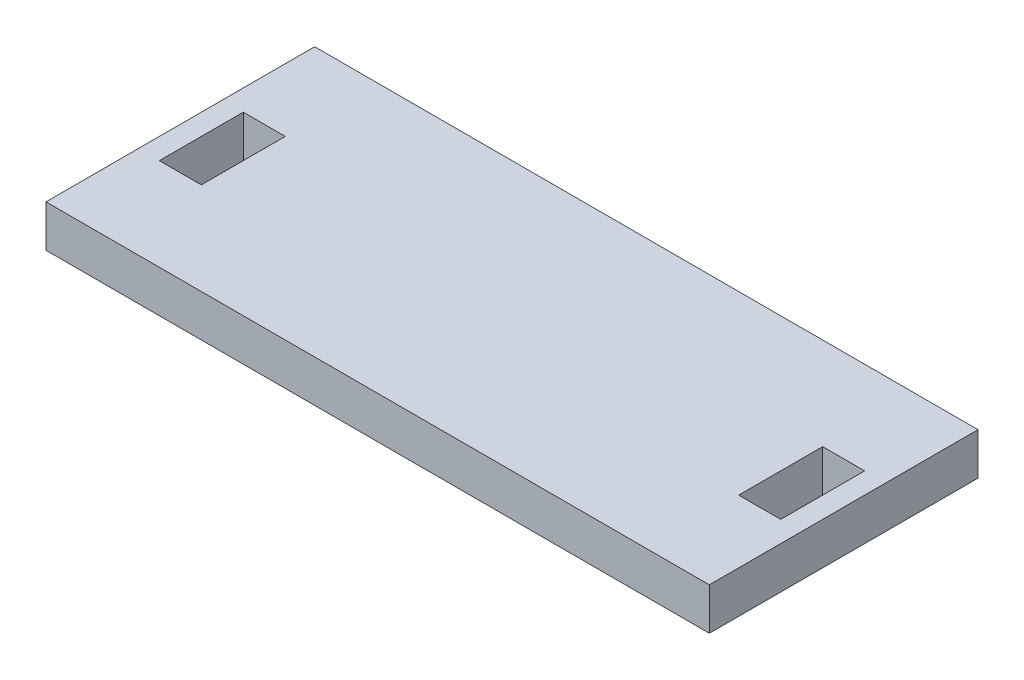
ISO-10303-21;
HEADER;
FILE_DESCRIPTION(('STEP AP214'),'2;1');
FILE_NAME('part.step','',(''),(''),'','','');
FILE_SCHEMA(('AUTOMOTIVE_DESIGN { 1 0 10303 214 1 1 1 1 }'));
ENDSEC;
DATA;
#1=APPLICATION_CONTEXT('core data for automotive mechanical design processes');
#2=APPLICATION_PROTOCOL_DEFINITION('international standard','automotive_design',2000,#1);
#3=PRODUCT_CONTEXT('',#1,'mechanical');
#4=PRODUCT('Part','Part','',(#3));
#5=PRODUCT_RELATED_PRODUCT_CATEGORY('part','',(#4));
#6=PRODUCT_DEFINITION_FORMATION('','',#4);
#7=PRODUCT_DEFINITION_CONTEXT('part definition',#1,'design');
#8=PRODUCT_DEFINITION('design','',#6,#7);
#9=PRODUCT_DEFINITION_SHAPE('','',#8);
#10=(LENGTH_UNIT() NAMED_UNIT(*) SI_UNIT(.MILLI.,.METRE.));
#11=(NAMED_UNIT(*) PLANE_ANGLE_UNIT() SI_UNIT($,.RADIAN.));
#12=(NAMED_UNIT(*) SI_UNIT($,.STERADIAN.) SOLID_ANGLE_UNIT());
#13=UNCERTAINTY_MEASURE_WITH_UNIT(LENGTH_MEASURE(1.E-05),#10,'distance_accuracy_value','');
#14=(GEOMETRIC_REPRESENTATION_CONTEXT(3) GLOBAL_UNCERTAINTY_ASSIGNED_CONTEXT((#13)) GLOBAL_UNIT_ASSIGNED_CONTEXT((#10,
#11,#12)) REPRESENTATION_CONTEXT('',''));
#15=CARTESIAN_POINT('',(0.,0.,0.));
#16=DIRECTION('',(0.,0.,1.));
#17=DIRECTION('',(1.,0.,0.));
#18=AXIS2_PLACEMENT_3D('',#15,#16,#17);
#19=CARTESIAN_POINT('',(0.,3.175,0.));
#20=DIRECTION('',(0.,-1.,0.));
#21=DIRECTION('',(0.,0.,-1.));
#22=AXIS2_PLACEMENT_3D('',#19,#20,#21);
#23=PLANE('',#22);
#24=DIRECTION('',(0.,0.,-1.));
#25=VECTOR('',#24,1.);
#26=CARTESIAN_POINT('',(-20.32,3.175,3.175));
#27=LINE('',#26,#25);
#28=CARTESIAN_POINT('',(-20.32,3.175,3.175));
#29=VERTEX_POINT('',#28);
#30=CARTESIAN_POINT('',(-20.32,3.175,-3.175));
#31=VERTEX_POINT('',#30);
#32=EDGE_CURVE('E160',#29,#31,#27,.T.);
#33=ORIENTED_EDGE('',*,*,#32,.F.);
#34=DIRECTION('',(1.,0.,0.));
#35=VECTOR('',#34,1.);
#36=CARTESIAN_POINT('',(-23.495,3.175,3.175));
#37=LINE('',#36,#35);
#38=CARTESIAN_POINT('',(-23.495,3.175,3.175));
#39=VERTEX_POINT('',#38);
#40=EDGE_CURVE('E168',#39,#29,#37,.T.);
#41=ORIENTED_EDGE('',*,*,#40,.F.);
#42=DIRECTION('',(0.,0.,1.));
#43=VECTOR('',#42,1.);
#44=CARTESIAN_POINT('',(-23.495,3.175,3.175));
#45=LINE('',#44,#43);
#46=CARTESIAN_POINT('',(-23.495,3.175,-3.175));
#47=VERTEX_POINT('',#46);
#48=EDGE_CURVE('E165',#47,#39,#45,.T.);
#49=ORIENTED_EDGE('',*,*,#48,.F.);
#50=DIRECTION('',(-1.,0.,0.));
#51=VECTOR('',#50,1.);
#52=CARTESIAN_POINT('',(-23.495,3.175,-3.175));
#53=LINE('',#52,#51);
#54=EDGE_CURVE('E162',#31,#47,#53,.T.);
#55=ORIENTED_EDGE('',*,*,#54,.F.);
#56=EDGE_LOOP('',(#33,#41,#49,#55));
#57=FACE_BOUND('',#56,.T.);
#58=DIRECTION('',(0.,0.,-1.));
#59=VECTOR('',#58,1.);
#60=CARTESIAN_POINT('',(25.0825,3.175,10.16));
#61=LINE('',#60,#59);
#62=CARTESIAN_POINT('',(25.0825,3.175,10.16));
#63=VERTEX_POINT('',#62);
#64=CARTESIAN_POINT('',(25.0825,3.175,-10.16));
#65=VERTEX_POINT('',#64);
#66=EDGE_CURVE('E191',#63,#65,#61,.T.);
#67=ORIENTED_EDGE('',*,*,#66,.T.);
#68=DIRECTION('',(-1.,0.,0.));
#69=VECTOR('',#68,1.);
#70=CARTESIAN_POINT('',(-25.0825,3.175,-10.16));
#71=LINE('',#70,#69);
#72=CARTESIAN_POINT('',(-25.0825,3.175,-10.16));
#73=VERTEX_POINT('',#72);
#74=EDGE_CURVE('E194',#65,#73,#71,.T.);
#75=ORIENTED_EDGE('',*,*,#74,.T.);
#76=DIRECTION('',(0.,0.,1.));
#77=VECTOR('',#76,1.);
#78=CARTESIAN_POINT('',(-25.0825,3.175,10.16));
#79=LINE('',#78,#77);
#80=CARTESIAN_POINT('',(-25.0825,3.175,10.16));
#81=VERTEX_POINT('',#80);
#82=EDGE_CURVE('E197',#73,#81,#79,.T.);
#83=ORIENTED_EDGE('',*,*,#82,.T.);
#84=DIRECTION('',(1.,0.,0.));
#85=VECTOR('',#84,1.);
#86=CARTESIAN_POINT('',(-25.0825,3.175,10.16));
#87=LINE('',#86,#85);
#88=EDGE_CURVE('E199',#81,#63,#87,.T.);
#89=ORIENTED_EDGE('',*,*,#88,.T.);
#90=EDGE_LOOP('',(#67,#75,#83,#89));
#91=FACE_BOUND('',#90,.T.);
#92=DIRECTION('',(0.,0.,-1.));
#93=VECTOR('',#92,1.);
#94=CARTESIAN_POINT('',(23.495,3.175,3.175));
#95=LINE('',#94,#93);
#96=CARTESIAN_POINT('',(23.495,3.175,3.175));
#97=VERTEX_POINT('',#96);
#98=CARTESIAN_POINT('',(23.495,3.175,-3.175));
#99=VERTEX_POINT('',#98);
#100=EDGE_CURVE('E124',#97,#99,#95,.T.);
#101=ORIENTED_EDGE('',*,*,#100,.F.);
#102=DIRECTION('',(1.,0.,0.));
#103=VECTOR('',#102,1.);
#104=CARTESIAN_POINT('',(20.32,3.175,3.175));
#105=LINE('',#104,#103);
#106=CARTESIAN_POINT('',(20.32,3.175,3.175));
#107=VERTEX_POINT('',#106);
#108=EDGE_CURVE('E146',#107,#97,#105,.T.);
#109=ORIENTED_EDGE('',*,*,#108,.F.);
#110=DIRECTION('',(0.,0.,1.));
#111=VECTOR('',#110,1.);
#112=CARTESIAN_POINT('',(20.32,3.175,3.175));
#113=LINE('',#112,#111);
#114=CARTESIAN_POINT('',(20.32,3.175,-3.175));
#115=VERTEX_POINT('',#114);
#116=EDGE_CURVE('E144',#115,#107,#113,.T.);
#117=ORIENTED_EDGE('',*,*,#116,.F.);
#118=DIRECTION('',(-1.,0.,0.));
#119=VECTOR('',#118,1.);
#120=CARTESIAN_POINT('',(20.32,3.175,-3.175));
#121=LINE('',#120,#119);
#122=EDGE_CURVE('E132',#99,#115,#121,.T.);
#123=ORIENTED_EDGE('',*,*,#122,.F.);
#124=EDGE_LOOP('',(#101,#109,#117,#123));
#125=FACE_BOUND('',#124,.T.);
#126=ADVANCED_FACE('F35',(#57,#91,#125),#23,.F.);
#127=CARTESIAN_POINT('',(0.,0.,0.));
#128=DIRECTION('',(0.,-1.,0.));
#129=DIRECTION('',(0.,0.,-1.));
#130=AXIS2_PLACEMENT_3D('',#127,#128,#129);
#131=PLANE('',#130);
#132=DIRECTION('',(0.,0.,-1.));
#133=VECTOR('',#132,1.);
#134=CARTESIAN_POINT('',(25.0825,0.,10.16));
#135=LINE('',#134,#133);
#136=CARTESIAN_POINT('',(25.0825,0.,10.16));
#137=VERTEX_POINT('',#136);
#138=CARTESIAN_POINT('',(25.0825,0.,-10.16));
#139=VERTEX_POINT('',#138);
#140=EDGE_CURVE('E190',#137,#139,#135,.T.);
#141=ORIENTED_EDGE('',*,*,#140,.F.);
#142=DIRECTION('',(1.,0.,0.));
#143=VECTOR('',#142,1.);
#144=CARTESIAN_POINT('',(-25.0825,0.,10.16));
#145=LINE('',#144,#143);
#146=CARTESIAN_POINT('',(-25.0825,0.,10.16));
#147=VERTEX_POINT('',#146);
#148=EDGE_CURVE('E195',#147,#137,#145,.T.);
#149=ORIENTED_EDGE('',*,*,#148,.F.);
#150=DIRECTION('',(0.,0.,1.));
#151=VECTOR('',#150,1.);
#152=CARTESIAN_POINT('',(-25.0825,0.,10.16));
#153=LINE('',#152,#151);
#154=CARTESIAN_POINT('',(-25.0825,0.,-10.16));
#155=VERTEX_POINT('',#154);
#156=EDGE_CURVE('E206',#155,#147,#153,.T.);
#157=ORIENTED_EDGE('',*,*,#156,.F.);
#158=DIRECTION('',(-1.,0.,0.));
#159=VECTOR('',#158,1.);
#160=CARTESIAN_POINT('',(-25.0825,0.,-10.16));
#161=LINE('',#160,#159);
#162=EDGE_CURVE('E204',#139,#155,#161,.T.);
#163=ORIENTED_EDGE('',*,*,#162,.F.);
#164=EDGE_LOOP('',(#141,#149,#157,#163));
#165=FACE_BOUND('',#164,.T.);
#166=DIRECTION('',(1.,0.,0.));
#167=VECTOR('',#166,1.);
#168=CARTESIAN_POINT('',(-23.495,0.,3.175));
#169=LINE('',#168,#167);
#170=CARTESIAN_POINT('',(-23.495,0.,3.175));
#171=VERTEX_POINT('',#170);
#172=CARTESIAN_POINT('',(-20.32,0.,3.175));
#173=VERTEX_POINT('',#172);
#174=EDGE_CURVE('E163',#171,#173,#169,.T.);
#175=ORIENTED_EDGE('',*,*,#174,.T.);
#176=DIRECTION('',(0.,0.,-1.));
#177=VECTOR('',#176,1.);
#178=CARTESIAN_POINT('',(-20.32,0.,3.175));
#179=LINE('',#178,#177);
#180=CARTESIAN_POINT('',(-20.32,0.,-3.175));
#181=VERTEX_POINT('',#180);
#182=EDGE_CURVE('E140',#173,#181,#179,.T.);
#183=ORIENTED_EDGE('',*,*,#182,.T.);
#184=DIRECTION('',(-1.,0.,0.));
#185=VECTOR('',#184,1.);
#186=CARTESIAN_POINT('',(-23.495,0.,-3.175));
#187=LINE('',#186,#185);
#188=CARTESIAN_POINT('',(-23.495,0.,-3.175));
#189=VERTEX_POINT('',#188);
#190=EDGE_CURVE('E173',#181,#189,#187,.T.);
#191=ORIENTED_EDGE('',*,*,#190,.T.);
#192=DIRECTION('',(0.,0.,1.));
#193=VECTOR('',#192,1.);
#194=CARTESIAN_POINT('',(-23.495,0.,3.175));
#195=LINE('',#194,#193);
#196=EDGE_CURVE('E176',#189,#171,#195,.T.);
#197=ORIENTED_EDGE('',*,*,#196,.T.);
#198=EDGE_LOOP('',(#175,#183,#191,#197));
#199=FACE_BOUND('',#198,.T.);
#200=DIRECTION('',(1.,0.,0.));
#201=VECTOR('',#200,1.);
#202=CARTESIAN_POINT('',(20.32,0.,3.175));
#203=LINE('',#202,#201);
#204=CARTESIAN_POINT('',(20.32,0.,3.175));
#205=VERTEX_POINT('',#204);
#206=CARTESIAN_POINT('',(23.495,0.,3.175));
#207=VERTEX_POINT('',#206);
#208=EDGE_CURVE('E133',#205,#207,#203,.T.);
#209=ORIENTED_EDGE('',*,*,#208,.T.);
#210=DIRECTION('',(0.,0.,-1.));
#211=VECTOR('',#210,1.);
#212=CARTESIAN_POINT('',(23.495,0.,3.175));
#213=LINE('',#212,#211);
#214=CARTESIAN_POINT('',(23.495,0.,-3.175));
#215=VERTEX_POINT('',#214);
#216=EDGE_CURVE('E58',#207,#215,#213,.T.);
#217=ORIENTED_EDGE('',*,*,#216,.T.);
#218=DIRECTION('',(-1.,0.,0.));
#219=VECTOR('',#218,1.);
#220=CARTESIAN_POINT('',(20.32,0.,-3.175));
#221=LINE('',#220,#219);
#222=CARTESIAN_POINT('',(20.32,0.,-3.175));
#223=VERTEX_POINT('',#222);
#224=EDGE_CURVE('E139',#215,#223,#221,.T.);
#225=ORIENTED_EDGE('',*,*,#224,.T.);
#226=DIRECTION('',(0.,0.,1.));
#227=VECTOR('',#226,1.);
#228=CARTESIAN_POINT('',(20.32,0.,3.175));
#229=LINE('',#228,#227);
#230=EDGE_CURVE('E152',#223,#205,#229,.T.);
#231=ORIENTED_EDGE('',*,*,#230,.T.);
#232=EDGE_LOOP('',(#209,#217,#225,#231));
#233=FACE_BOUND('',#232,.T.);
#234=ADVANCED_FACE('F224',(#165,#199,#233),#131,.T.);
#235=CARTESIAN_POINT('',(25.0825,3.175,10.16));
#236=DIRECTION('',(-1.,0.,0.));
#237=DIRECTION('',(0.,0.,1.));
#238=AXIS2_PLACEMENT_3D('',#235,#236,#237);
#239=PLANE('',#238);
#240=ORIENTED_EDGE('',*,*,#140,.T.);
#241=DIRECTION('',(0.,-1.,0.));
#242=VECTOR('',#241,1.);
#243=CARTESIAN_POINT('',(25.0825,3.175,-10.16));
#244=LINE('',#243,#242);
#245=EDGE_CURVE('E11',#65,#139,#244,.T.);
#246=ORIENTED_EDGE('',*,*,#245,.F.);
#247=ORIENTED_EDGE('',*,*,#66,.F.);
#248=DIRECTION('',(0.,-1.,0.));
#249=VECTOR('',#248,1.);
#250=CARTESIAN_POINT('',(25.0825,3.175,10.16));
#251=LINE('',#250,#249);
#252=EDGE_CURVE('E201',#63,#137,#251,.T.);
#253=ORIENTED_EDGE('',*,*,#252,.T.);
#254=EDGE_LOOP('',(#240,#246,#247,#253));
#255=FACE_BOUND('',#254,.T.);
#256=ADVANCED_FACE('F37',(#255),#239,.F.);
#257=CARTESIAN_POINT('',(-25.0825,3.175,-10.16));
#258=DIRECTION('',(0.,0.,1.));
#259=DIRECTION('',(1.,0.,0.));
#260=AXIS2_PLACEMENT_3D('',#257,#258,#259);
#261=PLANE('',#260);
#262=ORIENTED_EDGE('',*,*,#162,.T.);
#263=DIRECTION('',(0.,-1.,0.));
#264=VECTOR('',#263,1.);
#265=CARTESIAN_POINT('',(-25.0825,3.175,-10.16));
#266=LINE('',#265,#264);
#267=EDGE_CURVE('E43',#73,#155,#266,.T.);
#268=ORIENTED_EDGE('',*,*,#267,.F.);
#269=ORIENTED_EDGE('',*,*,#74,.F.);
#270=ORIENTED_EDGE('',*,*,#245,.T.);
#271=EDGE_LOOP('',(#262,#268,#269,#270));
#272=FACE_BOUND('',#271,.T.);
#273=ADVANCED_FACE('F234',(#272),#261,.F.);
#274=CARTESIAN_POINT('',(-25.0825,3.175,10.16));
#275=DIRECTION('',(1.,0.,0.));
#276=DIRECTION('',(0.,0.,-1.));
#277=AXIS2_PLACEMENT_3D('',#274,#275,#276);
#278=PLANE('',#277);
#279=ORIENTED_EDGE('',*,*,#156,.T.);
#280=DIRECTION('',(0.,-1.,0.));
#281=VECTOR('',#280,1.);
#282=CARTESIAN_POINT('',(-25.0825,3.175,10.16));
#283=LINE('',#282,#281);
#284=EDGE_CURVE('E211',#81,#147,#283,.T.);
#285=ORIENTED_EDGE('',*,*,#284,.F.);
#286=ORIENTED_EDGE('',*,*,#82,.F.);
#287=ORIENTED_EDGE('',*,*,#267,.T.);
#288=EDGE_LOOP('',(#279,#285,#286,#287));
#289=FACE_BOUND('',#288,.T.);
#290=ADVANCED_FACE('F218',(#289),#278,.F.);
#291=CARTESIAN_POINT('',(-25.0825,3.175,10.16));
#292=DIRECTION('',(0.,0.,-1.));
#293=DIRECTION('',(-1.,0.,0.));
#294=AXIS2_PLACEMENT_3D('',#291,#292,#293);
#295=PLANE('',#294);
#296=ORIENTED_EDGE('',*,*,#148,.T.);
#297=ORIENTED_EDGE('',*,*,#252,.F.);
#298=ORIENTED_EDGE('',*,*,#88,.F.);
#299=ORIENTED_EDGE('',*,*,#284,.T.);
#300=EDGE_LOOP('',(#296,#297,#298,#299));
#301=FACE_BOUND('',#300,.T.);
#302=ADVANCED_FACE('F228',(#301),#295,.F.);
#303=CARTESIAN_POINT('',(-20.32,3.175,3.175));
#304=DIRECTION('',(-1.,0.,0.));
#305=DIRECTION('',(0.,0.,1.));
#306=AXIS2_PLACEMENT_3D('',#303,#304,#305);
#307=PLANE('',#306);
#308=ORIENTED_EDGE('',*,*,#182,.F.);
#309=DIRECTION('',(0.,-1.,0.));
#310=VECTOR('',#309,1.);
#311=CARTESIAN_POINT('',(-20.32,3.175,3.175));
#312=LINE('',#311,#310);
#313=EDGE_CURVE('E170',#29,#173,#312,.T.);
#314=ORIENTED_EDGE('',*,*,#313,.F.);
#315=ORIENTED_EDGE('',*,*,#32,.T.);
#316=DIRECTION('',(0.,-1.,0.));
#317=VECTOR('',#316,1.);
#318=CARTESIAN_POINT('',(-20.32,3.175,-3.175));
#319=LINE('',#318,#317);
#320=EDGE_CURVE('E187',#31,#181,#319,.T.);
#321=ORIENTED_EDGE('',*,*,#320,.T.);
#322=EDGE_LOOP('',(#308,#314,#315,#321));
#323=FACE_BOUND('',#322,.T.);
#324=ADVANCED_FACE('F250',(#323),#307,.T.);
#325=CARTESIAN_POINT('',(-23.495,3.175,-3.175));
#326=DIRECTION('',(0.,0.,1.));
#327=DIRECTION('',(1.,0.,0.));
#328=AXIS2_PLACEMENT_3D('',#325,#326,#327);
#329=PLANE('',#328);
#330=ORIENTED_EDGE('',*,*,#190,.F.);
#331=ORIENTED_EDGE('',*,*,#320,.F.);
#332=ORIENTED_EDGE('',*,*,#54,.T.);
#333=DIRECTION('',(0.,-1.,0.));
#334=VECTOR('',#333,1.);
#335=CARTESIAN_POINT('',(-23.495,3.175,-3.175));
#336=LINE('',#335,#334);
#337=EDGE_CURVE('E185',#47,#189,#336,.T.);
#338=ORIENTED_EDGE('',*,*,#337,.T.);
#339=EDGE_LOOP('',(#330,#331,#332,#338));
#340=FACE_BOUND('',#339,.T.);
#341=ADVANCED_FACE('F257',(#340),#329,.T.);
#342=CARTESIAN_POINT('',(-23.495,3.175,3.175));
#343=DIRECTION('',(1.,0.,0.));
#344=DIRECTION('',(0.,0.,-1.));
#345=AXIS2_PLACEMENT_3D('',#342,#343,#344);
#346=PLANE('',#345);
#347=ORIENTED_EDGE('',*,*,#196,.F.);
#348=ORIENTED_EDGE('',*,*,#337,.F.);
#349=ORIENTED_EDGE('',*,*,#48,.T.);
#350=DIRECTION('',(0.,-1.,0.));
#351=VECTOR('',#350,1.);
#352=CARTESIAN_POINT('',(-23.495,3.175,3.175));
#353=LINE('',#352,#351);
#354=EDGE_CURVE('E183',#39,#171,#353,.T.);
#355=ORIENTED_EDGE('',*,*,#354,.T.);
#356=EDGE_LOOP('',(#347,#348,#349,#355));
#357=FACE_BOUND('',#356,.T.);
#358=ADVANCED_FACE('F262',(#357),#346,.T.);
#359=CARTESIAN_POINT('',(-23.495,3.175,3.175));
#360=DIRECTION('',(0.,0.,-1.));
#361=DIRECTION('',(-1.,0.,0.));
#362=AXIS2_PLACEMENT_3D('',#359,#360,#361);
#363=PLANE('',#362);
#364=ORIENTED_EDGE('',*,*,#174,.F.);
#365=ORIENTED_EDGE('',*,*,#354,.F.);
#366=ORIENTED_EDGE('',*,*,#40,.T.);
#367=ORIENTED_EDGE('',*,*,#313,.T.);
#368=EDGE_LOOP('',(#364,#365,#366,#367));
#369=FACE_BOUND('',#368,.T.);
#370=ADVANCED_FACE('F268',(#369),#363,.T.);
#371=CARTESIAN_POINT('',(23.495,3.175,3.175));
#372=DIRECTION('',(-1.,0.,0.));
#373=DIRECTION('',(0.,0.,1.));
#374=AXIS2_PLACEMENT_3D('',#371,#372,#373);
#375=PLANE('',#374);
#376=ORIENTED_EDGE('',*,*,#216,.F.);
#377=DIRECTION('',(0.,-1.,0.));
#378=VECTOR('',#377,1.);
#379=CARTESIAN_POINT('',(23.495,3.175,3.175));
#380=LINE('',#379,#378);
#381=EDGE_CURVE('E128',#97,#207,#380,.T.);
#382=ORIENTED_EDGE('',*,*,#381,.F.);
#383=ORIENTED_EDGE('',*,*,#100,.T.);
#384=DIRECTION('',(0.,-1.,0.));
#385=VECTOR('',#384,1.);
#386=CARTESIAN_POINT('',(23.495,3.175,-3.175));
#387=LINE('',#386,#385);
#388=EDGE_CURVE('E127',#99,#215,#387,.T.);
#389=ORIENTED_EDGE('',*,*,#388,.T.);
#390=EDGE_LOOP('',(#376,#382,#383,#389));
#391=FACE_BOUND('',#390,.T.);
#392=ADVANCED_FACE('F126',(#391),#375,.T.);
#393=CARTESIAN_POINT('',(20.32,3.175,-3.175));
#394=DIRECTION('',(0.,0.,1.));
#395=DIRECTION('',(1.,0.,0.));
#396=AXIS2_PLACEMENT_3D('',#393,#394,#395);
#397=PLANE('',#396);
#398=ORIENTED_EDGE('',*,*,#224,.F.);
#399=ORIENTED_EDGE('',*,*,#388,.F.);
#400=ORIENTED_EDGE('',*,*,#122,.T.);
#401=DIRECTION('',(0.,-1.,0.));
#402=VECTOR('',#401,1.);
#403=CARTESIAN_POINT('',(20.32,3.175,-3.175));
#404=LINE('',#403,#402);
#405=EDGE_CURVE('E141',#115,#223,#404,.T.);
#406=ORIENTED_EDGE('',*,*,#405,.T.);
#407=EDGE_LOOP('',(#398,#399,#400,#406));
#408=FACE_BOUND('',#407,.T.);
#409=ADVANCED_FACE('F136',(#408),#397,.T.);
#410=CARTESIAN_POINT('',(20.32,3.175,3.175));
#411=DIRECTION('',(1.,0.,0.));
#412=DIRECTION('',(0.,0.,-1.));
#413=AXIS2_PLACEMENT_3D('',#410,#411,#412);
#414=PLANE('',#413);
#415=ORIENTED_EDGE('',*,*,#230,.F.);
#416=ORIENTED_EDGE('',*,*,#405,.F.);
#417=ORIENTED_EDGE('',*,*,#116,.T.);
#418=DIRECTION('',(0.,-1.,0.));
#419=VECTOR('',#418,1.);
#420=CARTESIAN_POINT('',(20.32,3.175,3.175));
#421=LINE('',#420,#419);
#422=EDGE_CURVE('E50',#107,#205,#421,.T.);
#423=ORIENTED_EDGE('',*,*,#422,.T.);
#424=EDGE_LOOP('',(#415,#416,#417,#423));
#425=FACE_BOUND('',#424,.T.);
#426=ADVANCED_FACE('F287',(#425),#414,.T.);
#427=CARTESIAN_POINT('',(20.32,3.175,3.175));
#428=DIRECTION('',(0.,0.,-1.));
#429=DIRECTION('',(-1.,0.,0.));
#430=AXIS2_PLACEMENT_3D('',#427,#428,#429);
#431=PLANE('',#430);
#432=ORIENTED_EDGE('',*,*,#208,.F.);
#433=ORIENTED_EDGE('',*,*,#422,.F.);
#434=ORIENTED_EDGE('',*,*,#108,.T.);
#435=ORIENTED_EDGE('',*,*,#381,.T.);
#436=EDGE_LOOP('',(#432,#433,#434,#435));
#437=FACE_BOUND('',#436,.T.);
#438=ADVANCED_FACE('F290',(#437),#431,.T.);
#439=CLOSED_SHELL('',(#126,#234,#256,#273,#290,#302,#324,#341,#358,#370,#392,#409,#426,#438));
#440=MANIFOLD_SOLID_BREP('B2',#439);
#441=ADVANCED_BREP_SHAPE_REPRESENTATION('',(#18,#440),#14);
#442=SHAPE_DEFINITION_REPRESENTATION(#9,#441);
ENDSEC;
END-ISO-10303-21;
